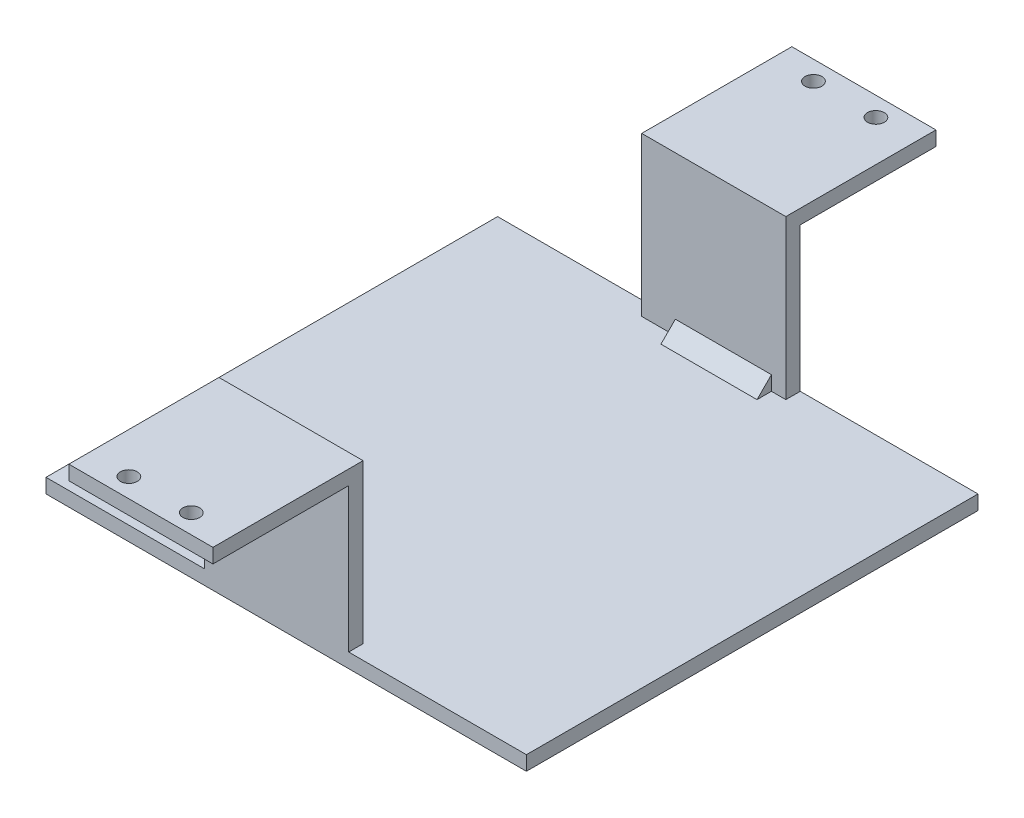
ISO-10303-21;
HEADER;
FILE_DESCRIPTION(('STEP AP214'),'2;1');
FILE_NAME('part.step','',(''),(''),'','','');
FILE_SCHEMA(('AUTOMOTIVE_DESIGN { 1 0 10303 214 1 1 1 1 }'));
ENDSEC;
DATA;
#1=APPLICATION_CONTEXT('core data for automotive mechanical design processes');
#2=APPLICATION_PROTOCOL_DEFINITION('international standard','automotive_design',2000,#1);
#3=PRODUCT_CONTEXT('',#1,'mechanical');
#4=PRODUCT('Part','Part','',(#3));
#5=PRODUCT_RELATED_PRODUCT_CATEGORY('part','',(#4));
#6=PRODUCT_DEFINITION_FORMATION('','',#4);
#7=PRODUCT_DEFINITION_CONTEXT('part definition',#1,'design');
#8=PRODUCT_DEFINITION('design','',#6,#7);
#9=PRODUCT_DEFINITION_SHAPE('','',#8);
#10=(LENGTH_UNIT() NAMED_UNIT(*) SI_UNIT(.MILLI.,.METRE.));
#11=(NAMED_UNIT(*) PLANE_ANGLE_UNIT() SI_UNIT($,.RADIAN.));
#12=(NAMED_UNIT(*) SI_UNIT($,.STERADIAN.) SOLID_ANGLE_UNIT());
#13=UNCERTAINTY_MEASURE_WITH_UNIT(LENGTH_MEASURE(1.E-05),#10,'distance_accuracy_value','');
#14=(GEOMETRIC_REPRESENTATION_CONTEXT(3) GLOBAL_UNCERTAINTY_ASSIGNED_CONTEXT((#13)) GLOBAL_UNIT_ASSIGNED_CONTEXT((#10,
#11,#12)) REPRESENTATION_CONTEXT('',''));
#15=CARTESIAN_POINT('',(0.,0.,0.));
#16=DIRECTION('',(0.,0.,1.));
#17=DIRECTION('',(1.,0.,0.));
#18=AXIS2_PLACEMENT_3D('',#15,#16,#17);
#19=CARTESIAN_POINT('',(-50.,-3.,-47.));
#20=DIRECTION('',(0.,0.,-1.));
#21=DIRECTION('',(-1.,0.,0.));
#22=AXIS2_PLACEMENT_3D('',#19,#20,#21);
#23=PLANE('',#22);
#24=DIRECTION('',(1.,0.,0.));
#25=VECTOR('',#24,1.);
#26=CARTESIAN_POINT('',(-17.,30.,-47.));
#27=LINE('',#26,#25);
#28=CARTESIAN_POINT('',(9.99999999999999,30.,-47.));
#29=VERTEX_POINT('',#28);
#30=CARTESIAN_POINT('',(13.,30.,-47.));
#31=VERTEX_POINT('',#30);
#32=EDGE_CURVE('E268',#29,#31,#27,.T.);
#33=ORIENTED_EDGE('',*,*,#32,.T.);
#34=DIRECTION('',(0.,-1.,0.));
#35=VECTOR('',#34,1.);
#36=CARTESIAN_POINT('',(13.,33.,-47.));
#37=LINE('',#36,#35);
#38=CARTESIAN_POINT('',(13.,0.,-47.));
#39=VERTEX_POINT('',#38);
#40=EDGE_CURVE('E416',#31,#39,#37,.T.);
#41=ORIENTED_EDGE('',*,*,#40,.T.);
#42=DIRECTION('',(-1.,0.,0.));
#43=VECTOR('',#42,1.);
#44=CARTESIAN_POINT('',(-50.,0.,-47.));
#45=LINE('',#44,#43);
#46=CARTESIAN_POINT('',(50.,0.,-47.));
#47=VERTEX_POINT('',#46);
#48=EDGE_CURVE('E423',#47,#39,#45,.T.);
#49=ORIENTED_EDGE('',*,*,#48,.F.);
#50=DIRECTION('',(0.,1.,0.));
#51=VECTOR('',#50,1.);
#52=CARTESIAN_POINT('',(50.,-3.,-47.));
#53=LINE('',#52,#51);
#54=CARTESIAN_POINT('',(50.,-3.,-47.));
#55=VERTEX_POINT('',#54);
#56=EDGE_CURVE('E42',#55,#47,#53,.T.);
#57=ORIENTED_EDGE('',*,*,#56,.F.);
#58=DIRECTION('',(-1.,0.,0.));
#59=VECTOR('',#58,1.);
#60=CARTESIAN_POINT('',(-50.,-3.,-47.));
#61=LINE('',#60,#59);
#62=CARTESIAN_POINT('',(-50.,-3.,-47.));
#63=VERTEX_POINT('',#62);
#64=EDGE_CURVE('E429',#55,#63,#61,.T.);
#65=ORIENTED_EDGE('',*,*,#64,.T.);
#66=DIRECTION('',(0.,1.,0.));
#67=VECTOR('',#66,1.);
#68=CARTESIAN_POINT('',(-50.,-3.,-47.));
#69=LINE('',#68,#67);
#70=CARTESIAN_POINT('',(-50.,0.,-47.));
#71=VERTEX_POINT('',#70);
#72=EDGE_CURVE('E11',#63,#71,#69,.T.);
#73=ORIENTED_EDGE('',*,*,#72,.T.);
#74=CARTESIAN_POINT('',(-17.,0.,-47.));
#75=VERTEX_POINT('',#74);
#76=EDGE_CURVE('E441',#75,#71,#45,.T.);
#77=ORIENTED_EDGE('',*,*,#76,.F.);
#78=DIRECTION('',(0.,-1.,0.));
#79=VECTOR('',#78,1.);
#80=CARTESIAN_POINT('',(-17.,33.,-47.));
#81=LINE('',#80,#79);
#82=CARTESIAN_POINT('',(-17.,30.,-47.));
#83=VERTEX_POINT('',#82);
#84=EDGE_CURVE('E414',#83,#75,#81,.T.);
#85=ORIENTED_EDGE('',*,*,#84,.F.);
#86=CARTESIAN_POINT('',(-10.,30.,-47.));
#87=VERTEX_POINT('',#86);
#88=EDGE_CURVE('E269',#83,#87,#27,.T.);
#89=ORIENTED_EDGE('',*,*,#88,.T.);
#90=DIRECTION('',(0.,-1.,0.));
#91=VECTOR('',#90,1.);
#92=CARTESIAN_POINT('',(-10.,30.,-47.));
#93=LINE('',#92,#91);
#94=CARTESIAN_POINT('',(-10.,27.,-47.));
#95=VERTEX_POINT('',#94);
#96=EDGE_CURVE('E299',#87,#95,#93,.T.);
#97=ORIENTED_EDGE('',*,*,#96,.T.);
#98=DIRECTION('',(-1.,0.,0.));
#99=VECTOR('',#98,1.);
#100=CARTESIAN_POINT('',(10.,27.,-47.));
#101=LINE('',#100,#99);
#102=CARTESIAN_POINT('',(9.99999999999999,27.,-47.));
#103=VERTEX_POINT('',#102);
#104=EDGE_CURVE('E304',#103,#95,#101,.T.);
#105=ORIENTED_EDGE('',*,*,#104,.F.);
#106=DIRECTION('',(0.,-1.,0.));
#107=VECTOR('',#106,1.);
#108=CARTESIAN_POINT('',(10.,30.,-47.));
#109=LINE('',#108,#107);
#110=EDGE_CURVE('E290',#29,#103,#109,.T.);
#111=ORIENTED_EDGE('',*,*,#110,.F.);
#112=EDGE_LOOP('',(#33,#41,#49,#57,#65,#73,#77,#85,#89,#97,#105,#111));
#113=FACE_BOUND('',#112,.T.);
#114=ADVANCED_FACE('F33',(#113),#23,.T.);
#115=CARTESIAN_POINT('',(0.,0.,0.));
#116=DIRECTION('',(0.,1.,0.));
#117=DIRECTION('',(0.,0.,1.));
#118=AXIS2_PLACEMENT_3D('',#115,#116,#117);
#119=PLANE('',#118);
#120=DIRECTION('',(1.,0.,0.));
#121=VECTOR('',#120,1.);
#122=CARTESIAN_POINT('',(13.,0.,-44.));
#123=LINE('',#122,#121);
#124=CARTESIAN_POINT('',(10.,0.,-44.));
#125=VERTEX_POINT('',#124);
#126=CARTESIAN_POINT('',(13.,0.,-44.));
#127=VERTEX_POINT('',#126);
#128=EDGE_CURVE('E406',#125,#127,#123,.T.);
#129=ORIENTED_EDGE('',*,*,#128,.F.);
#130=DIRECTION('',(0.,0.,-1.));
#131=VECTOR('',#130,1.);
#132=CARTESIAN_POINT('',(10.,0.,-41.));
#133=LINE('',#132,#131);
#134=CARTESIAN_POINT('',(10.,0.,-41.));
#135=VERTEX_POINT('',#134);
#136=EDGE_CURVE('E334',#135,#125,#133,.T.);
#137=ORIENTED_EDGE('',*,*,#136,.F.);
#138=DIRECTION('',(-1.,0.,0.));
#139=VECTOR('',#138,1.);
#140=CARTESIAN_POINT('',(10.,0.,-41.));
#141=LINE('',#140,#139);
#142=CARTESIAN_POINT('',(-10.,0.,-41.));
#143=VERTEX_POINT('',#142);
#144=EDGE_CURVE('E336',#135,#143,#141,.T.);
#145=ORIENTED_EDGE('',*,*,#144,.T.);
#146=DIRECTION('',(0.,0.,-1.));
#147=VECTOR('',#146,1.);
#148=CARTESIAN_POINT('',(-10.,0.,-41.));
#149=LINE('',#148,#147);
#150=CARTESIAN_POINT('',(-10.,0.,-44.));
#151=VERTEX_POINT('',#150);
#152=EDGE_CURVE('E332',#143,#151,#149,.T.);
#153=ORIENTED_EDGE('',*,*,#152,.T.);
#154=CARTESIAN_POINT('',(-17.,0.,-44.));
#155=VERTEX_POINT('',#154);
#156=EDGE_CURVE('E396',#155,#151,#123,.T.);
#157=ORIENTED_EDGE('',*,*,#156,.F.);
#158=DIRECTION('',(0.,0.,1.));
#159=VECTOR('',#158,1.);
#160=CARTESIAN_POINT('',(-17.,0.,-47.));
#161=LINE('',#160,#159);
#162=EDGE_CURVE('E403',#75,#155,#161,.T.);
#163=ORIENTED_EDGE('',*,*,#162,.F.);
#164=ORIENTED_EDGE('',*,*,#76,.T.);
#165=DIRECTION('',(0.,0.,1.));
#166=VECTOR('',#165,1.);
#167=CARTESIAN_POINT('',(-50.,0.,-47.));
#168=LINE('',#167,#166);
#169=CARTESIAN_POINT('',(-50.,0.,47.));
#170=VERTEX_POINT('',#169);
#171=EDGE_CURVE('E418',#71,#170,#168,.T.);
#172=ORIENTED_EDGE('',*,*,#171,.T.);
#173=DIRECTION('',(1.,0.,0.));
#174=VECTOR('',#173,1.);
#175=CARTESIAN_POINT('',(-50.,0.,47.));
#176=LINE('',#175,#174);
#177=CARTESIAN_POINT('',(-17.,0.,47.));
#178=VERTEX_POINT('',#177);
#179=EDGE_CURVE('E435',#170,#178,#176,.T.);
#180=ORIENTED_EDGE('',*,*,#179,.T.);
#181=DIRECTION('',(0.,0.,1.));
#182=VECTOR('',#181,1.);
#183=CARTESIAN_POINT('',(-17.,0.,47.));
#184=LINE('',#183,#182);
#185=CARTESIAN_POINT('',(-17.,0.,44.));
#186=VERTEX_POINT('',#185);
#187=EDGE_CURVE('E373',#186,#178,#184,.T.);
#188=ORIENTED_EDGE('',*,*,#187,.F.);
#189=DIRECTION('',(-1.,0.,0.));
#190=VECTOR('',#189,1.);
#191=CARTESIAN_POINT('',(13.,0.,44.));
#192=LINE('',#191,#190);
#193=CARTESIAN_POINT('',(-9.99999999999999,0.,44.));
#194=VERTEX_POINT('',#193);
#195=EDGE_CURVE('E379',#194,#186,#192,.T.);
#196=ORIENTED_EDGE('',*,*,#195,.F.);
#197=DIRECTION('',(0.,0.,-1.));
#198=VECTOR('',#197,1.);
#199=CARTESIAN_POINT('',(-10.,0.,41.));
#200=LINE('',#199,#198);
#201=CARTESIAN_POINT('',(-10.,0.,41.));
#202=VERTEX_POINT('',#201);
#203=EDGE_CURVE('E360',#194,#202,#200,.T.);
#204=ORIENTED_EDGE('',*,*,#203,.T.);
#205=DIRECTION('',(-1.,0.,0.));
#206=VECTOR('',#205,1.);
#207=CARTESIAN_POINT('',(10.,0.,41.));
#208=LINE('',#207,#206);
#209=CARTESIAN_POINT('',(10.,0.,41.));
#210=VERTEX_POINT('',#209);
#211=EDGE_CURVE('E365',#210,#202,#208,.T.);
#212=ORIENTED_EDGE('',*,*,#211,.F.);
#213=DIRECTION('',(0.,0.,-1.));
#214=VECTOR('',#213,1.);
#215=CARTESIAN_POINT('',(10.,0.,41.));
#216=LINE('',#215,#214);
#217=CARTESIAN_POINT('',(10.,0.,44.));
#218=VERTEX_POINT('',#217);
#219=EDGE_CURVE('E351',#218,#210,#216,.T.);
#220=ORIENTED_EDGE('',*,*,#219,.F.);
#221=CARTESIAN_POINT('',(13.,0.,44.));
#222=VERTEX_POINT('',#221);
#223=EDGE_CURVE('E380',#222,#218,#192,.T.);
#224=ORIENTED_EDGE('',*,*,#223,.F.);
#225=DIRECTION('',(0.,0.,-1.));
#226=VECTOR('',#225,1.);
#227=CARTESIAN_POINT('',(13.,0.,47.));
#228=LINE('',#227,#226);
#229=CARTESIAN_POINT('',(13.,0.,47.));
#230=VERTEX_POINT('',#229);
#231=EDGE_CURVE('E368',#230,#222,#228,.T.);
#232=ORIENTED_EDGE('',*,*,#231,.F.);
#233=CARTESIAN_POINT('',(50.,0.,47.));
#234=VERTEX_POINT('',#233);
#235=EDGE_CURVE('E434',#230,#234,#176,.T.);
#236=ORIENTED_EDGE('',*,*,#235,.T.);
#237=DIRECTION('',(0.,0.,-1.));
#238=VECTOR('',#237,1.);
#239=CARTESIAN_POINT('',(50.,0.,-47.));
#240=LINE('',#239,#238);
#241=EDGE_CURVE('E438',#234,#47,#240,.T.);
#242=ORIENTED_EDGE('',*,*,#241,.T.);
#243=ORIENTED_EDGE('',*,*,#48,.T.);
#244=DIRECTION('',(0.,0.,-1.));
#245=VECTOR('',#244,1.);
#246=CARTESIAN_POINT('',(13.,0.,-47.));
#247=LINE('',#246,#245);
#248=EDGE_CURVE('E392',#127,#39,#247,.T.);
#249=ORIENTED_EDGE('',*,*,#248,.F.);
#250=EDGE_LOOP('',(#129,#137,#145,#153,#157,#163,#164,#172,#180,#188,#196,#204,#212,#220,#224,
#232,#236,#242,#243,#249));
#251=FACE_BOUND('',#250,.T.);
#252=ADVANCED_FACE('F456',(#251),#119,.T.);
#253=CARTESIAN_POINT('',(13.,33.,-44.));
#254=DIRECTION('',(0.,0.,-1.));
#255=DIRECTION('',(-1.,0.,0.));
#256=AXIS2_PLACEMENT_3D('',#253,#254,#255);
#257=PLANE('',#256);
#258=DIRECTION('',(0.,1.,0.));
#259=VECTOR('',#258,1.);
#260=CARTESIAN_POINT('',(10.,0.,-44.));
#261=LINE('',#260,#259);
#262=CARTESIAN_POINT('',(10.,3.,-44.));
#263=VERTEX_POINT('',#262);
#264=EDGE_CURVE('E328',#125,#263,#261,.T.);
#265=ORIENTED_EDGE('',*,*,#264,.F.);
#266=ORIENTED_EDGE('',*,*,#128,.T.);
#267=DIRECTION('',(0.,-1.,0.));
#268=VECTOR('',#267,1.);
#269=CARTESIAN_POINT('',(13.,33.,-44.));
#270=LINE('',#269,#268);
#271=CARTESIAN_POINT('',(13.,33.,-44.));
#272=VERTEX_POINT('',#271);
#273=EDGE_CURVE('E400',#272,#127,#270,.T.);
#274=ORIENTED_EDGE('',*,*,#273,.F.);
#275=DIRECTION('',(1.,0.,0.));
#276=VECTOR('',#275,1.);
#277=CARTESIAN_POINT('',(13.,33.,-44.));
#278=LINE('',#277,#276);
#279=CARTESIAN_POINT('',(-17.,33.,-44.));
#280=VERTEX_POINT('',#279);
#281=EDGE_CURVE('E398',#280,#272,#278,.T.);
#282=ORIENTED_EDGE('',*,*,#281,.F.);
#283=DIRECTION('',(0.,-1.,0.));
#284=VECTOR('',#283,1.);
#285=CARTESIAN_POINT('',(-17.,33.,-44.));
#286=LINE('',#285,#284);
#287=EDGE_CURVE('E411',#280,#155,#286,.T.);
#288=ORIENTED_EDGE('',*,*,#287,.T.);
#289=ORIENTED_EDGE('',*,*,#156,.T.);
#290=DIRECTION('',(0.,1.,0.));
#291=VECTOR('',#290,1.);
#292=CARTESIAN_POINT('',(-10.,0.,-44.));
#293=LINE('',#292,#291);
#294=CARTESIAN_POINT('',(-10.,3.,-44.));
#295=VERTEX_POINT('',#294);
#296=EDGE_CURVE('E327',#151,#295,#293,.T.);
#297=ORIENTED_EDGE('',*,*,#296,.T.);
#298=DIRECTION('',(-1.,0.,0.));
#299=VECTOR('',#298,1.);
#300=CARTESIAN_POINT('',(10.,3.,-44.));
#301=LINE('',#300,#299);
#302=EDGE_CURVE('E345',#263,#295,#301,.T.);
#303=ORIENTED_EDGE('',*,*,#302,.F.);
#304=EDGE_LOOP('',(#265,#266,#274,#282,#288,#289,#297,#303));
#305=FACE_BOUND('',#304,.T.);
#306=ADVANCED_FACE('F492',(#305),#257,.F.);
#307=CARTESIAN_POINT('',(-50.,-3.,-47.));
#308=DIRECTION('',(-1.,0.,0.));
#309=DIRECTION('',(0.,0.,1.));
#310=AXIS2_PLACEMENT_3D('',#307,#308,#309);
#311=PLANE('',#310);
#312=ORIENTED_EDGE('',*,*,#171,.F.);
#313=ORIENTED_EDGE('',*,*,#72,.F.);
#314=DIRECTION('',(0.,0.,1.));
#315=VECTOR('',#314,1.);
#316=CARTESIAN_POINT('',(-50.,-3.,-47.));
#317=LINE('',#316,#315);
#318=CARTESIAN_POINT('',(-50.,-3.,47.));
#319=VERTEX_POINT('',#318);
#320=EDGE_CURVE('E419',#63,#319,#317,.T.);
#321=ORIENTED_EDGE('',*,*,#320,.T.);
#322=DIRECTION('',(0.,1.,0.));
#323=VECTOR('',#322,1.);
#324=CARTESIAN_POINT('',(-50.,-3.,47.));
#325=LINE('',#324,#323);
#326=EDGE_CURVE('E37',#319,#170,#325,.T.);
#327=ORIENTED_EDGE('',*,*,#326,.T.);
#328=EDGE_LOOP('',(#312,#313,#321,#327));
#329=FACE_BOUND('',#328,.T.);
#330=ADVANCED_FACE('F35',(#329),#311,.T.);
#331=CARTESIAN_POINT('',(50.,-3.,-47.));
#332=DIRECTION('',(1.,0.,0.));
#333=DIRECTION('',(0.,0.,-1.));
#334=AXIS2_PLACEMENT_3D('',#331,#332,#333);
#335=PLANE('',#334);
#336=ORIENTED_EDGE('',*,*,#241,.F.);
#337=DIRECTION('',(0.,1.,0.));
#338=VECTOR('',#337,1.);
#339=CARTESIAN_POINT('',(50.,-3.,47.));
#340=LINE('',#339,#338);
#341=CARTESIAN_POINT('',(50.,-3.,47.));
#342=VERTEX_POINT('',#341);
#343=EDGE_CURVE('E444',#342,#234,#340,.T.);
#344=ORIENTED_EDGE('',*,*,#343,.F.);
#345=DIRECTION('',(0.,0.,-1.));
#346=VECTOR('',#345,1.);
#347=CARTESIAN_POINT('',(50.,-3.,-47.));
#348=LINE('',#347,#346);
#349=EDGE_CURVE('E426',#342,#55,#348,.T.);
#350=ORIENTED_EDGE('',*,*,#349,.T.);
#351=ORIENTED_EDGE('',*,*,#56,.T.);
#352=EDGE_LOOP('',(#336,#344,#350,#351));
#353=FACE_BOUND('',#352,.T.);
#354=ADVANCED_FACE('F465',(#353),#335,.T.);
#355=CARTESIAN_POINT('',(-50.,-3.,47.));
#356=DIRECTION('',(0.,0.,1.));
#357=DIRECTION('',(1.,0.,0.));
#358=AXIS2_PLACEMENT_3D('',#355,#356,#357);
#359=PLANE('',#358);
#360=DIRECTION('',(-1.,0.,0.));
#361=VECTOR('',#360,1.);
#362=CARTESIAN_POINT('',(13.,30.,47.));
#363=LINE('',#362,#361);
#364=CARTESIAN_POINT('',(-10.,30.,47.));
#365=VERTEX_POINT('',#364);
#366=CARTESIAN_POINT('',(-17.,30.,47.));
#367=VERTEX_POINT('',#366);
#368=EDGE_CURVE('E57',#365,#367,#363,.T.);
#369=ORIENTED_EDGE('',*,*,#368,.T.);
#370=DIRECTION('',(0.,-1.,0.));
#371=VECTOR('',#370,1.);
#372=CARTESIAN_POINT('',(-17.,33.,47.));
#373=LINE('',#372,#371);
#374=EDGE_CURVE('E237',#367,#178,#373,.T.);
#375=ORIENTED_EDGE('',*,*,#374,.T.);
#376=ORIENTED_EDGE('',*,*,#179,.F.);
#377=ORIENTED_EDGE('',*,*,#326,.F.);
#378=DIRECTION('',(1.,0.,0.));
#379=VECTOR('',#378,1.);
#380=CARTESIAN_POINT('',(-50.,-3.,47.));
#381=LINE('',#380,#379);
#382=EDGE_CURVE('E422',#319,#342,#381,.T.);
#383=ORIENTED_EDGE('',*,*,#382,.T.);
#384=ORIENTED_EDGE('',*,*,#343,.T.);
#385=ORIENTED_EDGE('',*,*,#235,.F.);
#386=DIRECTION('',(0.,-1.,0.));
#387=VECTOR('',#386,1.);
#388=CARTESIAN_POINT('',(13.,33.,47.));
#389=LINE('',#388,#387);
#390=CARTESIAN_POINT('',(13.,30.,47.));
#391=VERTEX_POINT('',#390);
#392=EDGE_CURVE('E50',#391,#230,#389,.T.);
#393=ORIENTED_EDGE('',*,*,#392,.F.);
#394=CARTESIAN_POINT('',(10.,30.,47.));
#395=VERTEX_POINT('',#394);
#396=EDGE_CURVE('E239',#391,#395,#363,.T.);
#397=ORIENTED_EDGE('',*,*,#396,.T.);
#398=DIRECTION('',(0.,1.,0.));
#399=VECTOR('',#398,1.);
#400=CARTESIAN_POINT('',(10.,27.,47.));
#401=LINE('',#400,#399);
#402=CARTESIAN_POINT('',(10.,27.,47.));
#403=VERTEX_POINT('',#402);
#404=EDGE_CURVE('E308',#403,#395,#401,.T.);
#405=ORIENTED_EDGE('',*,*,#404,.F.);
#406=DIRECTION('',(-1.,0.,0.));
#407=VECTOR('',#406,1.);
#408=CARTESIAN_POINT('',(10.,27.,47.));
#409=LINE('',#408,#407);
#410=CARTESIAN_POINT('',(-10.,27.,47.));
#411=VERTEX_POINT('',#410);
#412=EDGE_CURVE('E316',#403,#411,#409,.T.);
#413=ORIENTED_EDGE('',*,*,#412,.T.);
#414=DIRECTION('',(0.,1.,0.));
#415=VECTOR('',#414,1.);
#416=CARTESIAN_POINT('',(-10.,27.,47.));
#417=LINE('',#416,#415);
#418=EDGE_CURVE('E307',#411,#365,#417,.T.);
#419=ORIENTED_EDGE('',*,*,#418,.T.);
#420=EDGE_LOOP('',(#369,#375,#376,#377,#383,#384,#385,#393,#397,#405,#413,#419));
#421=FACE_BOUND('',#420,.T.);
#422=ADVANCED_FACE('F452',(#421),#359,.T.);
#423=CARTESIAN_POINT('',(0.,-3.,0.));
#424=DIRECTION('',(0.,1.,0.));
#425=DIRECTION('',(0.,0.,1.));
#426=AXIS2_PLACEMENT_3D('',#423,#424,#425);
#427=PLANE('',#426);
#428=ORIENTED_EDGE('',*,*,#320,.F.);
#429=ORIENTED_EDGE('',*,*,#64,.F.);
#430=ORIENTED_EDGE('',*,*,#349,.F.);
#431=ORIENTED_EDGE('',*,*,#382,.F.);
#432=EDGE_LOOP('',(#428,#429,#430,#431));
#433=FACE_BOUND('',#432,.T.);
#434=ADVANCED_FACE('F462',(#433),#427,.F.);
#435=CARTESIAN_POINT('',(13.,33.,-47.));
#436=DIRECTION('',(-1.,0.,0.));
#437=DIRECTION('',(0.,0.,1.));
#438=AXIS2_PLACEMENT_3D('',#435,#436,#437);
#439=PLANE('',#438);
#440=ORIENTED_EDGE('',*,*,#248,.T.);
#441=ORIENTED_EDGE('',*,*,#40,.F.);
#442=DIRECTION('',(0.,0.,-1.));
#443=VECTOR('',#442,1.);
#444=CARTESIAN_POINT('',(13.,30.,-47.));
#445=LINE('',#444,#443);
#446=CARTESIAN_POINT('',(13.,30.,-75.25));
#447=VERTEX_POINT('',#446);
#448=EDGE_CURVE('E272',#31,#447,#445,.T.);
#449=ORIENTED_EDGE('',*,*,#448,.T.);
#450=DIRECTION('',(0.,1.,0.));
#451=VECTOR('',#450,1.);
#452=CARTESIAN_POINT('',(13.,30.,-75.25));
#453=LINE('',#452,#451);
#454=CARTESIAN_POINT('',(13.,33.,-75.25));
#455=VERTEX_POINT('',#454);
#456=EDGE_CURVE('E278',#447,#455,#453,.T.);
#457=ORIENTED_EDGE('',*,*,#456,.T.);
#458=DIRECTION('',(0.,0.,-1.));
#459=VECTOR('',#458,1.);
#460=CARTESIAN_POINT('',(13.,33.,-47.));
#461=LINE('',#460,#459);
#462=EDGE_CURVE('E393',#272,#455,#461,.T.);
#463=ORIENTED_EDGE('',*,*,#462,.F.);
#464=ORIENTED_EDGE('',*,*,#273,.T.);
#465=EDGE_LOOP('',(#440,#441,#449,#457,#463,#464));
#466=FACE_BOUND('',#465,.T.);
#467=ADVANCED_FACE('F473',(#466),#439,.F.);
#468=CARTESIAN_POINT('',(-17.,33.,-47.));
#469=DIRECTION('',(1.,0.,0.));
#470=DIRECTION('',(0.,0.,-1.));
#471=AXIS2_PLACEMENT_3D('',#468,#469,#470);
#472=PLANE('',#471);
#473=ORIENTED_EDGE('',*,*,#162,.T.);
#474=ORIENTED_EDGE('',*,*,#287,.F.);
#475=DIRECTION('',(0.,0.,1.));
#476=VECTOR('',#475,1.);
#477=CARTESIAN_POINT('',(-17.,33.,-47.));
#478=LINE('',#477,#476);
#479=CARTESIAN_POINT('',(-17.,33.,-75.25));
#480=VERTEX_POINT('',#479);
#481=EDGE_CURVE('E395',#480,#280,#478,.T.);
#482=ORIENTED_EDGE('',*,*,#481,.F.);
#483=DIRECTION('',(0.,1.,0.));
#484=VECTOR('',#483,1.);
#485=CARTESIAN_POINT('',(-17.,30.,-75.25));
#486=LINE('',#485,#484);
#487=CARTESIAN_POINT('',(-17.,30.,-75.25));
#488=VERTEX_POINT('',#487);
#489=EDGE_CURVE('E281',#488,#480,#486,.T.);
#490=ORIENTED_EDGE('',*,*,#489,.F.);
#491=DIRECTION('',(0.,0.,1.));
#492=VECTOR('',#491,1.);
#493=CARTESIAN_POINT('',(-17.,30.,-47.));
#494=LINE('',#493,#492);
#495=EDGE_CURVE('E265',#488,#83,#494,.T.);
#496=ORIENTED_EDGE('',*,*,#495,.T.);
#497=ORIENTED_EDGE('',*,*,#84,.T.);
#498=EDGE_LOOP('',(#473,#474,#482,#490,#496,#497));
#499=FACE_BOUND('',#498,.T.);
#500=ADVANCED_FACE('F505',(#499),#472,.F.);
#501=CARTESIAN_POINT('',(0.,33.,0.));
#502=DIRECTION('',(0.,-1.,0.));
#503=DIRECTION('',(0.,0.,-1.));
#504=AXIS2_PLACEMENT_3D('',#501,#502,#503);
#505=PLANE('',#504);
#506=ORIENTED_EDGE('',*,*,#462,.T.);
#507=DIRECTION('',(-1.,0.,0.));
#508=VECTOR('',#507,1.);
#509=CARTESIAN_POINT('',(-17.,33.,-75.25));
#510=LINE('',#509,#508);
#511=EDGE_CURVE('E262',#455,#480,#510,.T.);
#512=ORIENTED_EDGE('',*,*,#511,.T.);
#513=ORIENTED_EDGE('',*,*,#481,.T.);
#514=ORIENTED_EDGE('',*,*,#281,.T.);
#515=EDGE_LOOP('',(#506,#512,#513,#514));
#516=FACE_BOUND('',#515,.T.);
#517=CARTESIAN_POINT('',(4.50000000000001,33.,-71.25));
#518=DIRECTION('',(0.,1.,0.));
#519=DIRECTION('',(0.,0.,1.));
#520=AXIS2_PLACEMENT_3D('',#517,#518,#519);
#521=CIRCLE('',#520,1.75);
#522=CARTESIAN_POINT('',(4.50000000000001,33.,-69.5));
#523=VERTEX_POINT('',#522);
#524=EDGE_CURVE('E251',#523,#523,#521,.T.);
#525=ORIENTED_EDGE('',*,*,#524,.F.);
#526=EDGE_LOOP('',(#525));
#527=FACE_BOUND('',#526,.T.);
#528=CARTESIAN_POINT('',(-8.5,33.,-71.25));
#529=DIRECTION('',(0.,1.,0.));
#530=DIRECTION('',(0.,0.,1.));
#531=AXIS2_PLACEMENT_3D('',#528,#529,#530);
#532=CIRCLE('',#531,1.75);
#533=CARTESIAN_POINT('',(-8.5,33.,-69.5));
#534=VERTEX_POINT('',#533);
#535=EDGE_CURVE('E256',#534,#534,#532,.T.);
#536=ORIENTED_EDGE('',*,*,#535,.F.);
#537=EDGE_LOOP('',(#536));
#538=FACE_BOUND('',#537,.T.);
#539=ADVANCED_FACE('F486',(#516,#527,#538),#505,.F.);
#540=CARTESIAN_POINT('',(13.,33.,47.));
#541=DIRECTION('',(-1.,0.,0.));
#542=DIRECTION('',(0.,0.,1.));
#543=AXIS2_PLACEMENT_3D('',#540,#541,#542);
#544=PLANE('',#543);
#545=ORIENTED_EDGE('',*,*,#231,.T.);
#546=DIRECTION('',(0.,-1.,0.));
#547=VECTOR('',#546,1.);
#548=CARTESIAN_POINT('',(13.,33.,44.));
#549=LINE('',#548,#547);
#550=CARTESIAN_POINT('',(13.,33.,44.));
#551=VERTEX_POINT('',#550);
#552=EDGE_CURVE('E389',#551,#222,#549,.T.);
#553=ORIENTED_EDGE('',*,*,#552,.F.);
#554=DIRECTION('',(0.,0.,-1.));
#555=VECTOR('',#554,1.);
#556=CARTESIAN_POINT('',(13.,33.,47.));
#557=LINE('',#556,#555);
#558=CARTESIAN_POINT('',(13.,33.,75.25));
#559=VERTEX_POINT('',#558);
#560=EDGE_CURVE('E369',#559,#551,#557,.T.);
#561=ORIENTED_EDGE('',*,*,#560,.F.);
#562=DIRECTION('',(0.,1.,0.));
#563=VECTOR('',#562,1.);
#564=CARTESIAN_POINT('',(13.,30.,75.25));
#565=LINE('',#564,#563);
#566=CARTESIAN_POINT('',(13.,30.,75.25));
#567=VERTEX_POINT('',#566);
#568=EDGE_CURVE('E231',#567,#559,#565,.T.);
#569=ORIENTED_EDGE('',*,*,#568,.F.);
#570=DIRECTION('',(0.,0.,-1.));
#571=VECTOR('',#570,1.);
#572=CARTESIAN_POINT('',(13.,30.,47.));
#573=LINE('',#572,#571);
#574=EDGE_CURVE('E245',#567,#391,#573,.T.);
#575=ORIENTED_EDGE('',*,*,#574,.T.);
#576=ORIENTED_EDGE('',*,*,#392,.T.);
#577=EDGE_LOOP('',(#545,#553,#561,#569,#575,#576));
#578=FACE_BOUND('',#577,.T.);
#579=ADVANCED_FACE('F550',(#578),#544,.F.);
#580=CARTESIAN_POINT('',(13.,33.,44.));
#581=DIRECTION('',(0.,0.,1.));
#582=DIRECTION('',(1.,0.,0.));
#583=AXIS2_PLACEMENT_3D('',#580,#581,#582);
#584=PLANE('',#583);
#585=ORIENTED_EDGE('',*,*,#223,.T.);
#586=DIRECTION('',(0.,-1.,0.));
#587=VECTOR('',#586,1.);
#588=CARTESIAN_POINT('',(10.,0.,44.));
#589=LINE('',#588,#587);
#590=CARTESIAN_POINT('',(10.,3.,44.));
#591=VERTEX_POINT('',#590);
#592=EDGE_CURVE('E348',#591,#218,#589,.T.);
#593=ORIENTED_EDGE('',*,*,#592,.F.);
#594=DIRECTION('',(-1.,0.,0.));
#595=VECTOR('',#594,1.);
#596=CARTESIAN_POINT('',(10.,3.,44.));
#597=LINE('',#596,#595);
#598=CARTESIAN_POINT('',(-10.,3.,44.));
#599=VERTEX_POINT('',#598);
#600=EDGE_CURVE('E358',#591,#599,#597,.T.);
#601=ORIENTED_EDGE('',*,*,#600,.T.);
#602=DIRECTION('',(0.,-1.,0.));
#603=VECTOR('',#602,1.);
#604=CARTESIAN_POINT('',(-10.,0.,44.));
#605=LINE('',#604,#603);
#606=EDGE_CURVE('E347',#599,#194,#605,.T.);
#607=ORIENTED_EDGE('',*,*,#606,.T.);
#608=ORIENTED_EDGE('',*,*,#195,.T.);
#609=DIRECTION('',(0.,-1.,0.));
#610=VECTOR('',#609,1.);
#611=CARTESIAN_POINT('',(-17.,33.,44.));
#612=LINE('',#611,#610);
#613=CARTESIAN_POINT('',(-17.,33.,44.));
#614=VERTEX_POINT('',#613);
#615=EDGE_CURVE('E386',#614,#186,#612,.T.);
#616=ORIENTED_EDGE('',*,*,#615,.F.);
#617=DIRECTION('',(-1.,0.,0.));
#618=VECTOR('',#617,1.);
#619=CARTESIAN_POINT('',(13.,33.,44.));
#620=LINE('',#619,#618);
#621=EDGE_CURVE('E372',#551,#614,#620,.T.);
#622=ORIENTED_EDGE('',*,*,#621,.F.);
#623=ORIENTED_EDGE('',*,*,#552,.T.);
#624=EDGE_LOOP('',(#585,#593,#601,#607,#608,#616,#622,#623));
#625=FACE_BOUND('',#624,.T.);
#626=ADVANCED_FACE('F553',(#625),#584,.F.);
#627=CARTESIAN_POINT('',(-17.,33.,47.));
#628=DIRECTION('',(1.,0.,0.));
#629=DIRECTION('',(0.,0.,-1.));
#630=AXIS2_PLACEMENT_3D('',#627,#628,#629);
#631=PLANE('',#630);
#632=ORIENTED_EDGE('',*,*,#187,.T.);
#633=ORIENTED_EDGE('',*,*,#374,.F.);
#634=DIRECTION('',(0.,0.,1.));
#635=VECTOR('',#634,1.);
#636=CARTESIAN_POINT('',(-17.,30.,47.));
#637=LINE('',#636,#635);
#638=CARTESIAN_POINT('',(-17.,30.,75.25));
#639=VERTEX_POINT('',#638);
#640=EDGE_CURVE('E234',#367,#639,#637,.T.);
#641=ORIENTED_EDGE('',*,*,#640,.T.);
#642=DIRECTION('',(0.,1.,0.));
#643=VECTOR('',#642,1.);
#644=CARTESIAN_POINT('',(-17.,30.,75.25));
#645=LINE('',#644,#643);
#646=CARTESIAN_POINT('',(-17.,33.,75.25));
#647=VERTEX_POINT('',#646);
#648=EDGE_CURVE('E221',#639,#647,#645,.T.);
#649=ORIENTED_EDGE('',*,*,#648,.T.);
#650=DIRECTION('',(0.,0.,1.));
#651=VECTOR('',#650,1.);
#652=CARTESIAN_POINT('',(-17.,33.,47.));
#653=LINE('',#652,#651);
#654=EDGE_CURVE('E375',#614,#647,#653,.T.);
#655=ORIENTED_EDGE('',*,*,#654,.F.);
#656=ORIENTED_EDGE('',*,*,#615,.T.);
#657=EDGE_LOOP('',(#632,#633,#641,#649,#655,#656));
#658=FACE_BOUND('',#657,.T.);
#659=ADVANCED_FACE('F236',(#658),#631,.F.);
#660=CARTESIAN_POINT('',(0.,33.,0.));
#661=DIRECTION('',(0.,1.,0.));
#662=DIRECTION('',(0.,0.,1.));
#663=AXIS2_PLACEMENT_3D('',#660,#661,#662);
#664=PLANE('',#663);
#665=ORIENTED_EDGE('',*,*,#560,.T.);
#666=ORIENTED_EDGE('',*,*,#621,.T.);
#667=ORIENTED_EDGE('',*,*,#654,.T.);
#668=DIRECTION('',(1.,0.,0.));
#669=VECTOR('',#668,1.);
#670=CARTESIAN_POINT('',(13.,33.,75.25));
#671=LINE('',#670,#669);
#672=EDGE_CURVE('E228',#647,#559,#671,.T.);
#673=ORIENTED_EDGE('',*,*,#672,.T.);
#674=EDGE_LOOP('',(#665,#666,#667,#673));
#675=FACE_BOUND('',#674,.T.);
#676=CARTESIAN_POINT('',(4.50000000000001,33.,71.25));
#677=DIRECTION('',(0.,1.,0.));
#678=DIRECTION('',(0.,0.,1.));
#679=AXIS2_PLACEMENT_3D('',#676,#677,#678);
#680=CIRCLE('',#679,1.75);
#681=CARTESIAN_POINT('',(4.50000000000001,33.,73.));
#682=VERTEX_POINT('',#681);
#683=EDGE_CURVE('E607',#682,#682,#680,.T.);
#684=ORIENTED_EDGE('',*,*,#683,.F.);
#685=EDGE_LOOP('',(#684));
#686=FACE_BOUND('',#685,.T.);
#687=CARTESIAN_POINT('',(-8.5,33.,71.25));
#688=DIRECTION('',(0.,1.,0.));
#689=DIRECTION('',(0.,0.,1.));
#690=AXIS2_PLACEMENT_3D('',#687,#688,#689);
#691=CIRCLE('',#690,1.75);
#692=CARTESIAN_POINT('',(-8.5,33.,73.));
#693=VERTEX_POINT('',#692);
#694=EDGE_CURVE('E601',#693,#693,#691,.T.);
#695=ORIENTED_EDGE('',*,*,#694,.F.);
#696=EDGE_LOOP('',(#695));
#697=FACE_BOUND('',#696,.T.);
#698=ADVANCED_FACE('F560',(#675,#686,#697),#664,.T.);
#699=CARTESIAN_POINT('',(10.,3.,44.));
#700=DIRECTION('',(0.,-0.707106781186548,0.707106781186548));
#701=DIRECTION('',(0.,-0.707106781186548,-0.707106781186548));
#702=AXIS2_PLACEMENT_3D('',#699,#700,#701);
#703=PLANE('',#702);
#704=DIRECTION('',(0.,0.707106781186547,0.707106781186547));
#705=VECTOR('',#704,1.);
#706=CARTESIAN_POINT('',(-10.,3.,44.));
#707=LINE('',#706,#705);
#708=EDGE_CURVE('E352',#202,#599,#707,.T.);
#709=ORIENTED_EDGE('',*,*,#708,.T.);
#710=ORIENTED_EDGE('',*,*,#600,.F.);
#711=DIRECTION('',(0.,0.707106781186547,0.707106781186547));
#712=VECTOR('',#711,1.);
#713=CARTESIAN_POINT('',(10.,3.,44.));
#714=LINE('',#713,#712);
#715=EDGE_CURVE('E355',#210,#591,#714,.T.);
#716=ORIENTED_EDGE('',*,*,#715,.F.);
#717=ORIENTED_EDGE('',*,*,#211,.T.);
#718=EDGE_LOOP('',(#709,#710,#716,#717));
#719=FACE_BOUND('',#718,.T.);
#720=ADVANCED_FACE('F563',(#719),#703,.F.);
#721=CARTESIAN_POINT('',(10.,0.,0.));
#722=DIRECTION('',(1.,0.,0.));
#723=DIRECTION('',(0.,0.,-1.));
#724=AXIS2_PLACEMENT_3D('',#721,#722,#723);
#725=PLANE('',#724);
#726=ORIENTED_EDGE('',*,*,#592,.T.);
#727=ORIENTED_EDGE('',*,*,#219,.T.);
#728=ORIENTED_EDGE('',*,*,#715,.T.);
#729=EDGE_LOOP('',(#726,#727,#728));
#730=FACE_BOUND('',#729,.T.);
#731=ADVANCED_FACE('F567',(#730),#725,.T.);
#732=CARTESIAN_POINT('',(-10.,0.,0.));
#733=DIRECTION('',(1.,0.,0.));
#734=DIRECTION('',(0.,0.,-1.));
#735=AXIS2_PLACEMENT_3D('',#732,#733,#734);
#736=PLANE('',#735);
#737=ORIENTED_EDGE('',*,*,#606,.F.);
#738=ORIENTED_EDGE('',*,*,#708,.F.);
#739=ORIENTED_EDGE('',*,*,#203,.F.);
#740=EDGE_LOOP('',(#737,#738,#739));
#741=FACE_BOUND('',#740,.T.);
#742=ADVANCED_FACE('F569',(#741),#736,.F.);
#743=CARTESIAN_POINT('',(10.,3.,-44.));
#744=DIRECTION('',(0.,-0.707106781186548,-0.707106781186548));
#745=DIRECTION('',(0.,0.707106781186548,-0.707106781186548));
#746=AXIS2_PLACEMENT_3D('',#743,#744,#745);
#747=PLANE('',#746);
#748=DIRECTION('',(0.,-0.707106781186547,0.707106781186547));
#749=VECTOR('',#748,1.);
#750=CARTESIAN_POINT('',(-10.,3.,-44.));
#751=LINE('',#750,#749);
#752=EDGE_CURVE('E339',#295,#143,#751,.T.);
#753=ORIENTED_EDGE('',*,*,#752,.T.);
#754=ORIENTED_EDGE('',*,*,#144,.F.);
#755=DIRECTION('',(0.,-0.707106781186547,0.707106781186547));
#756=VECTOR('',#755,1.);
#757=CARTESIAN_POINT('',(10.,3.,-44.));
#758=LINE('',#757,#756);
#759=EDGE_CURVE('E331',#263,#135,#758,.T.);
#760=ORIENTED_EDGE('',*,*,#759,.F.);
#761=ORIENTED_EDGE('',*,*,#302,.T.);
#762=EDGE_LOOP('',(#753,#754,#760,#761));
#763=FACE_BOUND('',#762,.T.);
#764=ADVANCED_FACE('F499',(#763),#747,.F.);
#765=CARTESIAN_POINT('',(10.,0.,0.));
#766=DIRECTION('',(-1.,0.,0.));
#767=DIRECTION('',(0.,0.,1.));
#768=AXIS2_PLACEMENT_3D('',#765,#766,#767);
#769=PLANE('',#768);
#770=ORIENTED_EDGE('',*,*,#264,.T.);
#771=ORIENTED_EDGE('',*,*,#759,.T.);
#772=ORIENTED_EDGE('',*,*,#136,.T.);
#773=EDGE_LOOP('',(#770,#771,#772));
#774=FACE_BOUND('',#773,.T.);
#775=ADVANCED_FACE('F497',(#774),#769,.F.);
#776=CARTESIAN_POINT('',(-10.,0.,0.));
#777=DIRECTION('',(-1.,0.,0.));
#778=DIRECTION('',(0.,0.,1.));
#779=AXIS2_PLACEMENT_3D('',#776,#777,#778);
#780=PLANE('',#779);
#781=ORIENTED_EDGE('',*,*,#296,.F.);
#782=ORIENTED_EDGE('',*,*,#152,.F.);
#783=ORIENTED_EDGE('',*,*,#752,.F.);
#784=EDGE_LOOP('',(#781,#782,#783));
#785=FACE_BOUND('',#784,.T.);
#786=ADVANCED_FACE('F503',(#785),#780,.T.);
#787=CARTESIAN_POINT('',(10.,30.,50.));
#788=DIRECTION('',(0.,0.707106781186548,-0.707106781186548));
#789=DIRECTION('',(0.,0.707106781186548,0.707106781186548));
#790=AXIS2_PLACEMENT_3D('',#787,#788,#789);
#791=PLANE('',#790);
#792=DIRECTION('',(0.,-0.707106781186547,-0.707106781186547));
#793=VECTOR('',#792,1.);
#794=CARTESIAN_POINT('',(-10.,30.,50.));
#795=LINE('',#794,#793);
#796=CARTESIAN_POINT('',(-10.,30.,50.));
#797=VERTEX_POINT('',#796);
#798=EDGE_CURVE('E312',#797,#411,#795,.T.);
#799=ORIENTED_EDGE('',*,*,#798,.T.);
#800=ORIENTED_EDGE('',*,*,#412,.F.);
#801=DIRECTION('',(0.,-0.707106781186547,-0.707106781186547));
#802=VECTOR('',#801,1.);
#803=CARTESIAN_POINT('',(10.,30.,50.));
#804=LINE('',#803,#802);
#805=CARTESIAN_POINT('',(10.,30.,50.));
#806=VERTEX_POINT('',#805);
#807=EDGE_CURVE('E314',#806,#403,#804,.T.);
#808=ORIENTED_EDGE('',*,*,#807,.F.);
#809=DIRECTION('',(-1.,0.,0.));
#810=VECTOR('',#809,1.);
#811=CARTESIAN_POINT('',(10.,30.,50.));
#812=LINE('',#811,#810);
#813=EDGE_CURVE('E324',#806,#797,#812,.T.);
#814=ORIENTED_EDGE('',*,*,#813,.T.);
#815=EDGE_LOOP('',(#799,#800,#808,#814));
#816=FACE_BOUND('',#815,.T.);
#817=ADVANCED_FACE('F580',(#816),#791,.F.);
#818=CARTESIAN_POINT('',(10.,0.,0.));
#819=DIRECTION('',(1.,0.,0.));
#820=DIRECTION('',(0.,0.,-1.));
#821=AXIS2_PLACEMENT_3D('',#818,#819,#820);
#822=PLANE('',#821);
#823=ORIENTED_EDGE('',*,*,#404,.T.);
#824=DIRECTION('',(0.,0.,1.));
#825=VECTOR('',#824,1.);
#826=CARTESIAN_POINT('',(10.,30.,47.));
#827=LINE('',#826,#825);
#828=EDGE_CURVE('E311',#395,#806,#827,.T.);
#829=ORIENTED_EDGE('',*,*,#828,.T.);
#830=ORIENTED_EDGE('',*,*,#807,.T.);
#831=EDGE_LOOP('',(#823,#829,#830));
#832=FACE_BOUND('',#831,.T.);
#833=ADVANCED_FACE('F585',(#832),#822,.T.);
#834=CARTESIAN_POINT('',(-10.,0.,0.));
#835=DIRECTION('',(1.,0.,0.));
#836=DIRECTION('',(0.,0.,-1.));
#837=AXIS2_PLACEMENT_3D('',#834,#835,#836);
#838=PLANE('',#837);
#839=ORIENTED_EDGE('',*,*,#418,.F.);
#840=ORIENTED_EDGE('',*,*,#798,.F.);
#841=DIRECTION('',(0.,0.,1.));
#842=VECTOR('',#841,1.);
#843=CARTESIAN_POINT('',(-10.,30.,47.));
#844=LINE('',#843,#842);
#845=EDGE_CURVE('E318',#365,#797,#844,.T.);
#846=ORIENTED_EDGE('',*,*,#845,.F.);
#847=EDGE_LOOP('',(#839,#840,#846));
#848=FACE_BOUND('',#847,.T.);
#849=ADVANCED_FACE('F523',(#848),#838,.F.);
#850=CARTESIAN_POINT('',(10.,27.,-47.));
#851=DIRECTION('',(0.,0.707106781186548,0.707106781186548));
#852=DIRECTION('',(0.,-0.707106781186548,0.707106781186548));
#853=AXIS2_PLACEMENT_3D('',#850,#851,#852);
#854=PLANE('',#853);
#855=DIRECTION('',(0.,0.707106781186547,-0.707106781186547));
#856=VECTOR('',#855,1.);
#857=CARTESIAN_POINT('',(-10.,27.,-47.));
#858=LINE('',#857,#856);
#859=CARTESIAN_POINT('',(-10.,30.,-50.));
#860=VERTEX_POINT('',#859);
#861=EDGE_CURVE('E291',#95,#860,#858,.T.);
#862=ORIENTED_EDGE('',*,*,#861,.T.);
#863=DIRECTION('',(-1.,0.,0.));
#864=VECTOR('',#863,1.);
#865=CARTESIAN_POINT('',(10.,30.,-50.));
#866=LINE('',#865,#864);
#867=CARTESIAN_POINT('',(10.,30.,-50.));
#868=VERTEX_POINT('',#867);
#869=EDGE_CURVE('E296',#868,#860,#866,.T.);
#870=ORIENTED_EDGE('',*,*,#869,.F.);
#871=DIRECTION('',(0.,0.707106781186547,-0.707106781186547));
#872=VECTOR('',#871,1.);
#873=CARTESIAN_POINT('',(10.,27.,-47.));
#874=LINE('',#873,#872);
#875=EDGE_CURVE('E294',#103,#868,#874,.T.);
#876=ORIENTED_EDGE('',*,*,#875,.F.);
#877=ORIENTED_EDGE('',*,*,#104,.T.);
#878=EDGE_LOOP('',(#862,#870,#876,#877));
#879=FACE_BOUND('',#878,.T.);
#880=ADVANCED_FACE('F513',(#879),#854,.F.);
#881=CARTESIAN_POINT('',(10.,0.,0.));
#882=DIRECTION('',(-1.,0.,0.));
#883=DIRECTION('',(0.,0.,1.));
#884=AXIS2_PLACEMENT_3D('',#881,#882,#883);
#885=PLANE('',#884);
#886=DIRECTION('',(0.,0.,1.));
#887=VECTOR('',#886,1.);
#888=CARTESIAN_POINT('',(10.,30.,-47.));
#889=LINE('',#888,#887);
#890=EDGE_CURVE('E287',#868,#29,#889,.T.);
#891=ORIENTED_EDGE('',*,*,#890,.T.);
#892=ORIENTED_EDGE('',*,*,#110,.T.);
#893=ORIENTED_EDGE('',*,*,#875,.T.);
#894=EDGE_LOOP('',(#891,#892,#893));
#895=FACE_BOUND('',#894,.T.);
#896=ADVANCED_FACE('F515',(#895),#885,.F.);
#897=CARTESIAN_POINT('',(-10.,0.,0.));
#898=DIRECTION('',(-1.,0.,0.));
#899=DIRECTION('',(0.,0.,1.));
#900=AXIS2_PLACEMENT_3D('',#897,#898,#899);
#901=PLANE('',#900);
#902=DIRECTION('',(0.,0.,1.));
#903=VECTOR('',#902,1.);
#904=CARTESIAN_POINT('',(-10.,30.,-47.));
#905=LINE('',#904,#903);
#906=EDGE_CURVE('E284',#860,#87,#905,.T.);
#907=ORIENTED_EDGE('',*,*,#906,.F.);
#908=ORIENTED_EDGE('',*,*,#861,.F.);
#909=ORIENTED_EDGE('',*,*,#96,.F.);
#910=EDGE_LOOP('',(#907,#908,#909));
#911=FACE_BOUND('',#910,.T.);
#912=ADVANCED_FACE('F510',(#911),#901,.T.);
#913=CARTESIAN_POINT('',(0.,30.,0.));
#914=DIRECTION('',(0.,-1.,0.));
#915=DIRECTION('',(0.,0.,-1.));
#916=AXIS2_PLACEMENT_3D('',#913,#914,#915);
#917=PLANE('',#916);
#918=CARTESIAN_POINT('',(-8.5,30.,-71.25));
#919=DIRECTION('',(0.,1.,0.));
#920=DIRECTION('',(0.,0.,1.));
#921=AXIS2_PLACEMENT_3D('',#918,#919,#920);
#922=CIRCLE('',#921,1.75);
#923=CARTESIAN_POINT('',(-8.5,30.,-69.5));
#924=VERTEX_POINT('',#923);
#925=EDGE_CURVE('E259',#924,#924,#922,.T.);
#926=ORIENTED_EDGE('',*,*,#925,.T.);
#927=EDGE_LOOP('',(#926));
#928=FACE_BOUND('',#927,.T.);
#929=CARTESIAN_POINT('',(4.50000000000001,30.,-71.25));
#930=DIRECTION('',(0.,1.,0.));
#931=DIRECTION('',(0.,0.,1.));
#932=AXIS2_PLACEMENT_3D('',#929,#930,#931);
#933=CIRCLE('',#932,1.75);
#934=CARTESIAN_POINT('',(4.50000000000001,30.,-69.5));
#935=VERTEX_POINT('',#934);
#936=EDGE_CURVE('E253',#935,#935,#933,.T.);
#937=ORIENTED_EDGE('',*,*,#936,.T.);
#938=EDGE_LOOP('',(#937));
#939=FACE_BOUND('',#938,.T.);
#940=ORIENTED_EDGE('',*,*,#890,.F.);
#941=ORIENTED_EDGE('',*,*,#869,.T.);
#942=ORIENTED_EDGE('',*,*,#906,.T.);
#943=ORIENTED_EDGE('',*,*,#88,.F.);
#944=ORIENTED_EDGE('',*,*,#495,.F.);
#945=DIRECTION('',(-1.,0.,0.));
#946=VECTOR('',#945,1.);
#947=CARTESIAN_POINT('',(-17.,30.,-75.25));
#948=LINE('',#947,#946);
#949=EDGE_CURVE('E275',#447,#488,#948,.T.);
#950=ORIENTED_EDGE('',*,*,#949,.F.);
#951=ORIENTED_EDGE('',*,*,#448,.F.);
#952=ORIENTED_EDGE('',*,*,#32,.F.);
#953=EDGE_LOOP('',(#940,#941,#942,#943,#944,#950,#951,#952));
#954=FACE_BOUND('',#953,.T.);
#955=ADVANCED_FACE('F477',(#928,#939,#954),#917,.T.);
#956=CARTESIAN_POINT('',(-17.,30.,-75.25));
#957=DIRECTION('',(0.,0.,-1.));
#958=DIRECTION('',(-1.,0.,0.));
#959=AXIS2_PLACEMENT_3D('',#956,#957,#958);
#960=PLANE('',#959);
#961=ORIENTED_EDGE('',*,*,#511,.F.);
#962=ORIENTED_EDGE('',*,*,#456,.F.);
#963=ORIENTED_EDGE('',*,*,#949,.T.);
#964=ORIENTED_EDGE('',*,*,#489,.T.);
#965=EDGE_LOOP('',(#961,#962,#963,#964));
#966=FACE_BOUND('',#965,.T.);
#967=ADVANCED_FACE('F482',(#966),#960,.T.);
#968=CARTESIAN_POINT('',(-8.5,30.,-71.25));
#969=DIRECTION('',(0.,1.,0.));
#970=DIRECTION('',(0.,0.,1.));
#971=AXIS2_PLACEMENT_3D('',#968,#969,#970);
#972=CYLINDRICAL_SURFACE('',#971,1.75);
#973=ORIENTED_EDGE('',*,*,#925,.F.);
#974=EDGE_LOOP('',(#973));
#975=FACE_BOUND('',#974,.T.);
#976=ORIENTED_EDGE('',*,*,#535,.T.);
#977=EDGE_LOOP('',(#976));
#978=FACE_BOUND('',#977,.T.);
#979=ADVANCED_FACE('F639',(#975,#978),#972,.F.);
#980=CARTESIAN_POINT('',(4.50000000000001,30.,-71.25));
#981=DIRECTION('',(0.,1.,0.));
#982=DIRECTION('',(0.,0.,1.));
#983=AXIS2_PLACEMENT_3D('',#980,#981,#982);
#984=CYLINDRICAL_SURFACE('',#983,1.75);
#985=ORIENTED_EDGE('',*,*,#936,.F.);
#986=EDGE_LOOP('',(#985));
#987=FACE_BOUND('',#986,.T.);
#988=ORIENTED_EDGE('',*,*,#524,.T.);
#989=EDGE_LOOP('',(#988));
#990=FACE_BOUND('',#989,.T.);
#991=ADVANCED_FACE('F636',(#987,#990),#984,.F.);
#992=CARTESIAN_POINT('',(13.,30.,75.25));
#993=DIRECTION('',(0.,0.,1.));
#994=DIRECTION('',(1.,0.,0.));
#995=AXIS2_PLACEMENT_3D('',#992,#993,#994);
#996=PLANE('',#995);
#997=ORIENTED_EDGE('',*,*,#672,.F.);
#998=ORIENTED_EDGE('',*,*,#648,.F.);
#999=DIRECTION('',(1.,0.,0.));
#1000=VECTOR('',#999,1.);
#1001=CARTESIAN_POINT('',(13.,30.,75.25));
#1002=LINE('',#1001,#1000);
#1003=EDGE_CURVE('E226',#639,#567,#1002,.T.);
#1004=ORIENTED_EDGE('',*,*,#1003,.T.);
#1005=ORIENTED_EDGE('',*,*,#568,.T.);
#1006=EDGE_LOOP('',(#997,#998,#1004,#1005));
#1007=FACE_BOUND('',#1006,.T.);
#1008=ADVANCED_FACE('F223',(#1007),#996,.T.);
#1009=CARTESIAN_POINT('',(0.,30.,0.));
#1010=DIRECTION('',(0.,-1.,0.));
#1011=DIRECTION('',(0.,0.,-1.));
#1012=AXIS2_PLACEMENT_3D('',#1009,#1010,#1011);
#1013=PLANE('',#1012);
#1014=CARTESIAN_POINT('',(4.50000000000001,30.,71.25));
#1015=DIRECTION('',(0.,1.,0.));
#1016=DIRECTION('',(0.,0.,1.));
#1017=AXIS2_PLACEMENT_3D('',#1014,#1015,#1016);
#1018=CIRCLE('',#1017,1.75);
#1019=CARTESIAN_POINT('',(4.50000000000001,30.,73.));
#1020=VERTEX_POINT('',#1019);
#1021=EDGE_CURVE('E604',#1020,#1020,#1018,.T.);
#1022=ORIENTED_EDGE('',*,*,#1021,.T.);
#1023=EDGE_LOOP('',(#1022));
#1024=FACE_BOUND('',#1023,.T.);
#1025=CARTESIAN_POINT('',(-8.5,30.,71.25));
#1026=DIRECTION('',(0.,1.,0.));
#1027=DIRECTION('',(0.,0.,1.));
#1028=AXIS2_PLACEMENT_3D('',#1025,#1026,#1027);
#1029=CIRCLE('',#1028,1.75);
#1030=CARTESIAN_POINT('',(-8.5,30.,73.));
#1031=VERTEX_POINT('',#1030);
#1032=EDGE_CURVE('E250',#1031,#1031,#1029,.T.);
#1033=ORIENTED_EDGE('',*,*,#1032,.T.);
#1034=EDGE_LOOP('',(#1033));
#1035=FACE_BOUND('',#1034,.T.);
#1036=ORIENTED_EDGE('',*,*,#813,.F.);
#1037=ORIENTED_EDGE('',*,*,#828,.F.);
#1038=ORIENTED_EDGE('',*,*,#396,.F.);
#1039=ORIENTED_EDGE('',*,*,#574,.F.);
#1040=ORIENTED_EDGE('',*,*,#1003,.F.);
#1041=ORIENTED_EDGE('',*,*,#640,.F.);
#1042=ORIENTED_EDGE('',*,*,#368,.F.);
#1043=ORIENTED_EDGE('',*,*,#845,.T.);
#1044=EDGE_LOOP('',(#1036,#1037,#1038,#1039,#1040,#1041,#1042,#1043));
#1045=FACE_BOUND('',#1044,.T.);
#1046=ADVANCED_FACE('F243',(#1024,#1035,#1045),#1013,.T.);
#1047=CARTESIAN_POINT('',(-8.5,30.,71.25));
#1048=DIRECTION('',(0.,1.,0.));
#1049=DIRECTION('',(0.,0.,1.));
#1050=AXIS2_PLACEMENT_3D('',#1047,#1048,#1049);
#1051=CYLINDRICAL_SURFACE('',#1050,1.75);
#1052=ORIENTED_EDGE('',*,*,#1032,.F.);
#1053=EDGE_LOOP('',(#1052));
#1054=FACE_BOUND('',#1053,.T.);
#1055=ORIENTED_EDGE('',*,*,#694,.T.);
#1056=EDGE_LOOP('',(#1055));
#1057=FACE_BOUND('',#1056,.T.);
#1058=ADVANCED_FACE('F618',(#1054,#1057),#1051,.F.);
#1059=CARTESIAN_POINT('',(4.50000000000001,30.,71.25));
#1060=DIRECTION('',(0.,1.,0.));
#1061=DIRECTION('',(0.,0.,1.));
#1062=AXIS2_PLACEMENT_3D('',#1059,#1060,#1061);
#1063=CYLINDRICAL_SURFACE('',#1062,1.75);
#1064=ORIENTED_EDGE('',*,*,#1021,.F.);
#1065=EDGE_LOOP('',(#1064));
#1066=FACE_BOUND('',#1065,.T.);
#1067=ORIENTED_EDGE('',*,*,#683,.T.);
#1068=EDGE_LOOP('',(#1067));
#1069=FACE_BOUND('',#1068,.T.);
#1070=ADVANCED_FACE('F615',(#1066,#1069),#1063,.F.);
#1071=CLOSED_SHELL('',(#114,#252,#306,#330,#354,#422,#434,#467,#500,#539,#579,#626,#659,#698,
#720,#731,#742,#764,#775,#786,#817,#833,#849,#880,#896,#912,#955,#967,#979,#991,#1008,#1046,
#1058,#1070));
#1072=MANIFOLD_SOLID_BREP('B2',#1071);
#1073=ADVANCED_BREP_SHAPE_REPRESENTATION('',(#18,#1072),#14);
#1074=SHAPE_DEFINITION_REPRESENTATION(#9,#1073);
ENDSEC;
END-ISO-10303-21;
